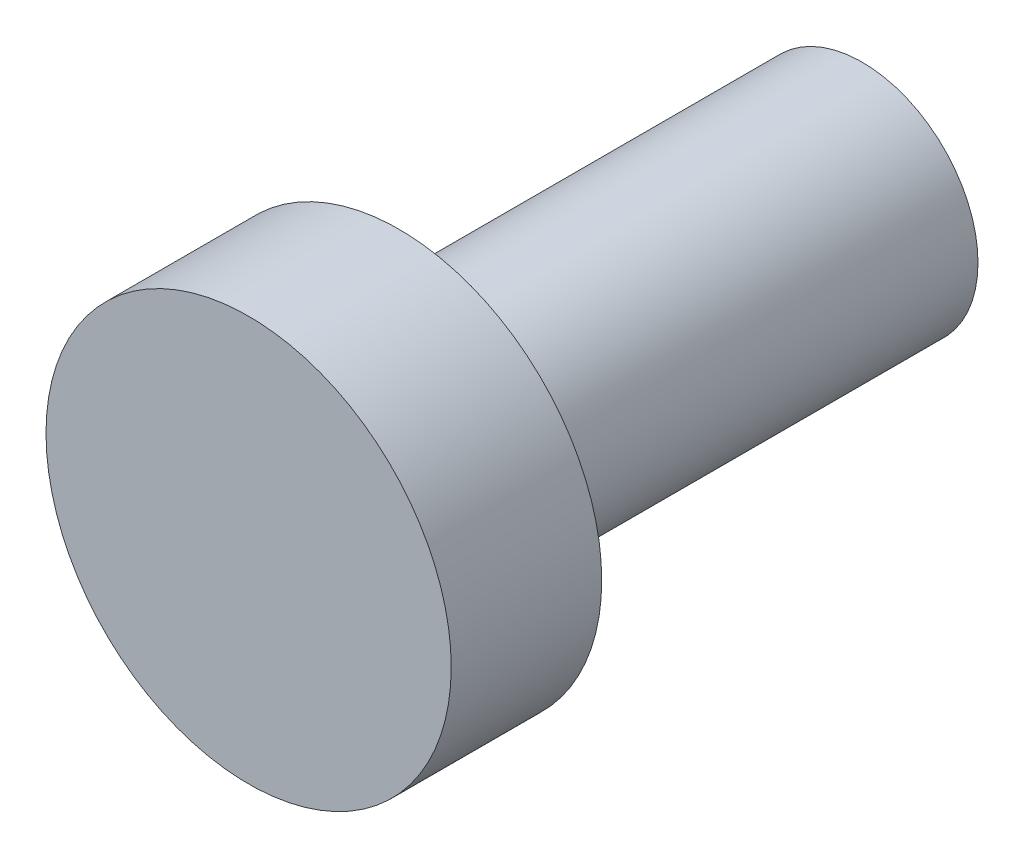
ISO-10303-21;
HEADER;
FILE_DESCRIPTION(('STEP AP214'),'2;1');
FILE_NAME('part.step','',(''),(''),'','','');
FILE_SCHEMA(('AUTOMOTIVE_DESIGN { 1 0 10303 214 1 1 1 1 }'));
ENDSEC;
DATA;
#1=APPLICATION_CONTEXT('core data for automotive mechanical design processes');
#2=APPLICATION_PROTOCOL_DEFINITION('international standard','automotive_design',2000,#1);
#3=PRODUCT_CONTEXT('',#1,'mechanical');
#4=PRODUCT('Part','Part','',(#3));
#5=PRODUCT_RELATED_PRODUCT_CATEGORY('part','',(#4));
#6=PRODUCT_DEFINITION_FORMATION('','',#4);
#7=PRODUCT_DEFINITION_CONTEXT('part definition',#1,'design');
#8=PRODUCT_DEFINITION('design','',#6,#7);
#9=PRODUCT_DEFINITION_SHAPE('','',#8);
#10=(LENGTH_UNIT() NAMED_UNIT(*) SI_UNIT(.MILLI.,.METRE.));
#11=(NAMED_UNIT(*) PLANE_ANGLE_UNIT() SI_UNIT($,.RADIAN.));
#12=(NAMED_UNIT(*) SI_UNIT($,.STERADIAN.) SOLID_ANGLE_UNIT());
#13=UNCERTAINTY_MEASURE_WITH_UNIT(LENGTH_MEASURE(1.E-05),#10,'distance_accuracy_value','');
#14=(GEOMETRIC_REPRESENTATION_CONTEXT(3) GLOBAL_UNCERTAINTY_ASSIGNED_CONTEXT((#13)) GLOBAL_UNIT_ASSIGNED_CONTEXT((#10,
#11,#12)) REPRESENTATION_CONTEXT('',''));
#15=CARTESIAN_POINT('',(0.,0.,0.));
#16=DIRECTION('',(0.,0.,1.));
#17=DIRECTION('',(1.,0.,0.));
#18=AXIS2_PLACEMENT_3D('',#15,#16,#17);
#19=CARTESIAN_POINT('',(0.,0.,1.3));
#20=DIRECTION('',(0.,0.,-1.));
#21=DIRECTION('',(-1.,0.,0.));
#22=AXIS2_PLACEMENT_3D('',#19,#20,#21);
#23=CYLINDRICAL_SURFACE('',#22,1.75);
#24=CARTESIAN_POINT('',(0.,0.,1.3));
#25=DIRECTION('',(0.,0.,1.));
#26=DIRECTION('',(1.,0.,0.));
#27=AXIS2_PLACEMENT_3D('',#24,#25,#26);
#28=CIRCLE('',#27,1.75);
#29=CARTESIAN_POINT('',(1.75,0.,1.3));
#30=VERTEX_POINT('',#29);
#31=EDGE_CURVE('E10',#30,#30,#28,.T.);
#32=ORIENTED_EDGE('',*,*,#31,.F.);
#33=EDGE_LOOP('',(#32));
#34=FACE_BOUND('',#33,.T.);
#35=CARTESIAN_POINT('',(0.,0.,0.));
#36=DIRECTION('',(0.,0.,1.));
#37=DIRECTION('',(1.,0.,0.));
#38=AXIS2_PLACEMENT_3D('',#35,#36,#37);
#39=CIRCLE('',#38,1.75);
#40=CARTESIAN_POINT('',(1.75,0.,0.));
#41=VERTEX_POINT('',#40);
#42=EDGE_CURVE('E45',#41,#41,#39,.T.);
#43=ORIENTED_EDGE('',*,*,#42,.T.);
#44=EDGE_LOOP('',(#43));
#45=FACE_BOUND('',#44,.T.);
#46=ADVANCED_FACE('F39',(#34,#45),#23,.T.);
#47=CARTESIAN_POINT('',(0.,0.,1.3));
#48=DIRECTION('',(0.,0.,1.));
#49=DIRECTION('',(1.,0.,0.));
#50=AXIS2_PLACEMENT_3D('',#47,#48,#49);
#51=PLANE('',#50);
#52=ORIENTED_EDGE('',*,*,#31,.T.);
#53=EDGE_LOOP('',(#52));
#54=FACE_BOUND('',#53,.T.);
#55=ADVANCED_FACE('F77',(#54),#51,.T.);
#56=CARTESIAN_POINT('',(0.,0.,0.));
#57=DIRECTION('',(0.,0.,1.));
#58=DIRECTION('',(1.,0.,0.));
#59=AXIS2_PLACEMENT_3D('',#56,#57,#58);
#60=PLANE('',#59);
#61=CARTESIAN_POINT('',(0.,0.,0.));
#62=DIRECTION('',(0.,0.,1.));
#63=DIRECTION('',(1.,0.,0.));
#64=AXIS2_PLACEMENT_3D('',#61,#62,#63);
#65=CIRCLE('',#64,1.);
#66=CARTESIAN_POINT('',(1.,0.,0.));
#67=VERTEX_POINT('',#66);
#68=EDGE_CURVE('E55',#67,#67,#65,.T.);
#69=ORIENTED_EDGE('',*,*,#68,.T.);
#70=EDGE_LOOP('',(#69));
#71=FACE_BOUND('',#70,.T.);
#72=ORIENTED_EDGE('',*,*,#42,.F.);
#73=EDGE_LOOP('',(#72));
#74=FACE_BOUND('',#73,.T.);
#75=ADVANCED_FACE('F62',(#71,#74),#60,.F.);
#76=CARTESIAN_POINT('',(0.,0.,0.));
#77=DIRECTION('',(0.,0.,-1.));
#78=DIRECTION('',(-1.,0.,0.));
#79=AXIS2_PLACEMENT_3D('',#76,#77,#78);
#80=CYLINDRICAL_SURFACE('',#79,1.);
#81=ORIENTED_EDGE('',*,*,#68,.F.);
#82=EDGE_LOOP('',(#81));
#83=FACE_BOUND('',#82,.T.);
#84=CARTESIAN_POINT('',(0.,0.,-4.));
#85=DIRECTION('',(0.,0.,1.));
#86=DIRECTION('',(1.,0.,0.));
#87=AXIS2_PLACEMENT_3D('',#84,#85,#86);
#88=CIRCLE('',#87,1.);
#89=CARTESIAN_POINT('',(1.,0.,-4.));
#90=VERTEX_POINT('',#89);
#91=EDGE_CURVE('E53',#90,#90,#88,.T.);
#92=ORIENTED_EDGE('',*,*,#91,.T.);
#93=EDGE_LOOP('',(#92));
#94=FACE_BOUND('',#93,.T.);
#95=ADVANCED_FACE('F66',(#83,#94),#80,.T.);
#96=CARTESIAN_POINT('',(0.,0.,-4.));
#97=DIRECTION('',(0.,0.,1.));
#98=DIRECTION('',(1.,0.,0.));
#99=AXIS2_PLACEMENT_3D('',#96,#97,#98);
#100=PLANE('',#99);
#101=ORIENTED_EDGE('',*,*,#91,.F.);
#102=EDGE_LOOP('',(#101));
#103=FACE_BOUND('',#102,.T.);
#104=ADVANCED_FACE('F68',(#103),#100,.F.);
#105=CLOSED_SHELL('',(#46,#55,#75,#95,#104));
#106=MANIFOLD_SOLID_BREP('B2',#105);
#107=ADVANCED_BREP_SHAPE_REPRESENTATION('',(#18,#106),#14);
#108=SHAPE_DEFINITION_REPRESENTATION(#9,#107);
ENDSEC;
END-ISO-10303-21;
